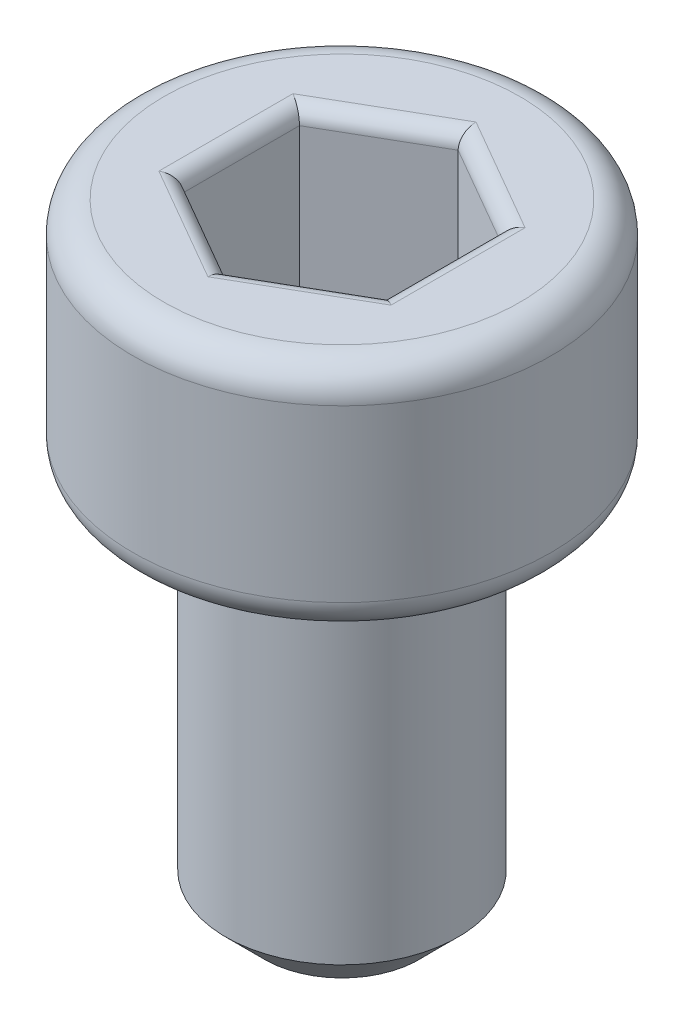
ISO-10303-21;
HEADER;
FILE_DESCRIPTION(('STEP AP214'),'2;1');
FILE_NAME('part.step','',(''),(''),'','','');
FILE_SCHEMA(('AUTOMOTIVE_DESIGN { 1 0 10303 214 1 1 1 1 }'));
ENDSEC;
DATA;
#1=APPLICATION_CONTEXT('core data for automotive mechanical design processes');
#2=APPLICATION_PROTOCOL_DEFINITION('international standard','automotive_design',2000,#1);
#3=PRODUCT_CONTEXT('',#1,'mechanical');
#4=PRODUCT('Part','Part','',(#3));
#5=PRODUCT_RELATED_PRODUCT_CATEGORY('part','',(#4));
#6=PRODUCT_DEFINITION_FORMATION('','',#4);
#7=PRODUCT_DEFINITION_CONTEXT('part definition',#1,'design');
#8=PRODUCT_DEFINITION('design','',#6,#7);
#9=PRODUCT_DEFINITION_SHAPE('','',#8);
#10=(LENGTH_UNIT() NAMED_UNIT(*) SI_UNIT(.MILLI.,.METRE.));
#11=(NAMED_UNIT(*) PLANE_ANGLE_UNIT() SI_UNIT($,.RADIAN.));
#12=(NAMED_UNIT(*) SI_UNIT($,.STERADIAN.) SOLID_ANGLE_UNIT());
#13=UNCERTAINTY_MEASURE_WITH_UNIT(LENGTH_MEASURE(1.E-05),#10,'distance_accuracy_value','');
#14=(GEOMETRIC_REPRESENTATION_CONTEXT(3) GLOBAL_UNCERTAINTY_ASSIGNED_CONTEXT((#13)) GLOBAL_UNIT_ASSIGNED_CONTEXT((#10,
#11,#12)) REPRESENTATION_CONTEXT('',''));
#15=CARTESIAN_POINT('',(0.,0.,0.));
#16=DIRECTION('',(0.,0.,1.));
#17=DIRECTION('',(1.,0.,0.));
#18=AXIS2_PLACEMENT_3D('',#15,#16,#17);
#19=CARTESIAN_POINT('',(-2.69999999999998,0.,0.));
#20=DIRECTION('',(0.,1.,0.));
#21=DIRECTION('',(-1.,0.,0.));
#22=AXIS2_PLACEMENT_3D('',#19,#20,#21);
#23=PLANE('',#22);
#24=DIRECTION('',(0.,0.,1.));
#25=VECTOR('',#24,1.);
#26=CARTESIAN_POINT('',(-1.49903810567666,0.,-0.750000000000001));
#27=LINE('',#26,#25);
#28=CARTESIAN_POINT('',(-1.49903810567666,0.,0.865470053837926));
#29=VERTEX_POINT('',#28);
#30=CARTESIAN_POINT('',(-1.49903810567666,0.,-0.865470053837926));
#31=VERTEX_POINT('',#30);
#32=EDGE_CURVE('E214',#29,#31,#27,.F.);
#33=ORIENTED_EDGE('',*,*,#32,.T.);
#34=DIRECTION('',(-0.866025403784438,0.,0.500000000000001));
#35=VECTOR('',#34,1.);
#36=CARTESIAN_POINT('',(-0.0999999999999996,0.,-1.67320508075689));
#37=LINE('',#36,#35);
#38=CARTESIAN_POINT('',(0.,0.,-1.73094010767585));
#39=VERTEX_POINT('',#38);
#40=EDGE_CURVE('E217',#31,#39,#37,.F.);
#41=ORIENTED_EDGE('',*,*,#40,.T.);
#42=DIRECTION('',(-0.866025403784438,0.,-0.500000000000001));
#43=VECTOR('',#42,1.);
#44=CARTESIAN_POINT('',(1.39903810567666,0.,-0.923205080756888));
#45=LINE('',#44,#43);
#46=CARTESIAN_POINT('',(1.49903810567666,0.,-0.865470053837926));
#47=VERTEX_POINT('',#46);
#48=EDGE_CURVE('E202',#39,#47,#45,.F.);
#49=ORIENTED_EDGE('',*,*,#48,.T.);
#50=DIRECTION('',(0.,0.,-1.));
#51=VECTOR('',#50,1.);
#52=CARTESIAN_POINT('',(1.49903810567666,0.,0.750000000000001));
#53=LINE('',#52,#51);
#54=CARTESIAN_POINT('',(1.49903810567666,0.,0.865470053837926));
#55=VERTEX_POINT('',#54);
#56=EDGE_CURVE('E205',#47,#55,#53,.F.);
#57=ORIENTED_EDGE('',*,*,#56,.T.);
#58=DIRECTION('',(0.866025403784438,0.,-0.500000000000001));
#59=VECTOR('',#58,1.);
#60=CARTESIAN_POINT('',(0.0999999999999994,0.,1.67320508075689));
#61=LINE('',#60,#59);
#62=CARTESIAN_POINT('',(0.,0.,1.73094010767585));
#63=VERTEX_POINT('',#62);
#64=EDGE_CURVE('E208',#55,#63,#61,.F.);
#65=ORIENTED_EDGE('',*,*,#64,.T.);
#66=DIRECTION('',(0.866025403784438,0.,0.500000000000001));
#67=VECTOR('',#66,1.);
#68=CARTESIAN_POINT('',(-1.39903810567666,0.,0.923205080756888));
#69=LINE('',#68,#67);
#70=EDGE_CURVE('E211',#63,#29,#69,.F.);
#71=ORIENTED_EDGE('',*,*,#70,.T.);
#72=EDGE_LOOP('',(#33,#41,#49,#57,#65,#71));
#73=FACE_BOUND('',#72,.T.);
#74=CARTESIAN_POINT('',(0.,0.,0.));
#75=DIRECTION('',(0.,1.,0.));
#76=DIRECTION('',(-1.,0.,0.));
#77=AXIS2_PLACEMENT_3D('',#74,#75,#76);
#78=CIRCLE('',#77,2.29999999999999);
#79=CARTESIAN_POINT('',(-2.29999999999999,0.,0.));
#80=VERTEX_POINT('',#79);
#81=EDGE_CURVE('E195',#80,#80,#78,.T.);
#82=ORIENTED_EDGE('',*,*,#81,.T.);
#83=EDGE_LOOP('',(#82));
#84=FACE_BOUND('',#83,.T.);
#85=ADVANCED_FACE('F39',(#73,#84),#23,.T.);
#86=CARTESIAN_POINT('',(0.,-8.,0.));
#87=DIRECTION('',(0.,-1.,0.));
#88=DIRECTION('',(1.,0.,0.));
#89=AXIS2_PLACEMENT_3D('',#86,#87,#88);
#90=PLANE('',#89);
#91=CARTESIAN_POINT('',(0.,-8.,0.));
#92=DIRECTION('',(0.,1.,0.));
#93=DIRECTION('',(-1.,0.,0.));
#94=AXIS2_PLACEMENT_3D('',#91,#92,#93);
#95=CIRCLE('',#94,1.);
#96=CARTESIAN_POINT('',(-0.999999999999999,-8.,0.));
#97=VERTEX_POINT('',#96);
#98=EDGE_CURVE('E179',#97,#97,#95,.T.);
#99=ORIENTED_EDGE('',*,*,#98,.F.);
#100=EDGE_LOOP('',(#99));
#101=FACE_BOUND('',#100,.T.);
#102=ADVANCED_FACE('F287',(#101),#90,.T.);
#103=CARTESIAN_POINT('',(0.,-7.50000000000001,0.));
#104=DIRECTION('',(0.,1.,0.));
#105=DIRECTION('',(-1.,0.,0.));
#106=AXIS2_PLACEMENT_3D('',#103,#104,#105);
#107=CONICAL_SURFACE('',#106,1.5,0.785398163397455);
#108=ORIENTED_EDGE('',*,*,#98,.T.);
#109=EDGE_LOOP('',(#108));
#110=FACE_BOUND('',#109,.T.);
#111=CARTESIAN_POINT('',(0.,-7.50000000000001,0.));
#112=DIRECTION('',(0.,1.,0.));
#113=DIRECTION('',(-1.,0.,0.));
#114=AXIS2_PLACEMENT_3D('',#111,#112,#113);
#115=CIRCLE('',#114,1.5);
#116=CARTESIAN_POINT('',(-1.5,-7.50000000000001,0.));
#117=VERTEX_POINT('',#116);
#118=EDGE_CURVE('E175',#117,#117,#115,.T.);
#119=ORIENTED_EDGE('',*,*,#118,.F.);
#120=EDGE_LOOP('',(#119));
#121=FACE_BOUND('',#120,.T.);
#122=ADVANCED_FACE('F293',(#110,#121),#107,.T.);
#123=CARTESIAN_POINT('',(0.,0.,0.));
#124=DIRECTION('',(0.,1.,0.));
#125=DIRECTION('',(-1.,0.,0.));
#126=AXIS2_PLACEMENT_3D('',#123,#124,#125);
#127=CYLINDRICAL_SURFACE('',#126,1.5);
#128=ORIENTED_EDGE('',*,*,#118,.T.);
#129=EDGE_LOOP('',(#128));
#130=FACE_BOUND('',#129,.T.);
#131=CARTESIAN_POINT('',(0.,-3.,0.));
#132=DIRECTION('',(0.,1.,0.));
#133=DIRECTION('',(-1.,0.,0.));
#134=AXIS2_PLACEMENT_3D('',#131,#132,#133);
#135=CIRCLE('',#134,1.5);
#136=CARTESIAN_POINT('',(-1.5,-3.,0.));
#137=VERTEX_POINT('',#136);
#138=EDGE_CURVE('E159',#137,#137,#135,.T.);
#139=ORIENTED_EDGE('',*,*,#138,.F.);
#140=EDGE_LOOP('',(#139));
#141=FACE_BOUND('',#140,.T.);
#142=ADVANCED_FACE('F391',(#130,#141),#127,.T.);
#143=CARTESIAN_POINT('',(-1.5,-3.,0.));
#144=DIRECTION('',(0.,-1.,0.));
#145=DIRECTION('',(1.,0.,0.));
#146=AXIS2_PLACEMENT_3D('',#143,#144,#145);
#147=PLANE('',#146);
#148=CARTESIAN_POINT('',(0.,-3.,0.));
#149=DIRECTION('',(0.,-1.,0.));
#150=DIRECTION('',(1.,0.,0.));
#151=AXIS2_PLACEMENT_3D('',#148,#149,#150);
#152=CIRCLE('',#151,2.29999999999999);
#153=CARTESIAN_POINT('',(2.29999999999999,-3.,0.));
#154=VERTEX_POINT('',#153);
#155=EDGE_CURVE('E191',#154,#154,#152,.T.);
#156=ORIENTED_EDGE('',*,*,#155,.T.);
#157=EDGE_LOOP('',(#156));
#158=FACE_BOUND('',#157,.T.);
#159=ORIENTED_EDGE('',*,*,#138,.T.);
#160=EDGE_LOOP('',(#159));
#161=FACE_BOUND('',#160,.T.);
#162=ADVANCED_FACE('F398',(#158,#161),#147,.T.);
#163=CARTESIAN_POINT('',(0.,0.,0.));
#164=DIRECTION('',(0.,1.,0.));
#165=DIRECTION('',(-1.,0.,0.));
#166=AXIS2_PLACEMENT_3D('',#163,#164,#165);
#167=CYLINDRICAL_SURFACE('',#166,2.69999999999999);
#168=CARTESIAN_POINT('',(0.,-2.6,0.));
#169=DIRECTION('',(0.,-1.,0.));
#170=DIRECTION('',(1.,0.,0.));
#171=AXIS2_PLACEMENT_3D('',#168,#169,#170);
#172=CIRCLE('',#171,2.69999999999999);
#173=CARTESIAN_POINT('',(2.69999999999999,-2.6,0.));
#174=VERTEX_POINT('',#173);
#175=EDGE_CURVE('E187',#174,#174,#172,.F.);
#176=ORIENTED_EDGE('',*,*,#175,.T.);
#177=EDGE_LOOP('',(#176));
#178=FACE_BOUND('',#177,.T.);
#179=CARTESIAN_POINT('',(0.,-0.4,0.));
#180=DIRECTION('',(0.,1.,0.));
#181=DIRECTION('',(-1.,0.,0.));
#182=AXIS2_PLACEMENT_3D('',#179,#180,#181);
#183=CIRCLE('',#182,2.69999999999999);
#184=CARTESIAN_POINT('',(-2.69999999999999,-0.4,0.));
#185=VERTEX_POINT('',#184);
#186=EDGE_CURVE('E183',#185,#185,#183,.F.);
#187=ORIENTED_EDGE('',*,*,#186,.T.);
#188=EDGE_LOOP('',(#187));
#189=FACE_BOUND('',#188,.T.);
#190=ADVANCED_FACE('F283',(#178,#189),#167,.T.);
#191=CARTESIAN_POINT('',(0.,-2.,-1.5));
#192=DIRECTION('',(0.500000000000001,0.,-0.866025403784438));
#193=DIRECTION('',(-0.866025403784438,0.,-0.500000000000001));
#194=AXIS2_PLACEMENT_3D('',#191,#192,#193);
#195=PLANE('',#194);
#196=DIRECTION('',(0.,1.,0.));
#197=VECTOR('',#196,1.);
#198=CARTESIAN_POINT('',(1.29903810567666,-2.,-0.750000000000001));
#199=LINE('',#198,#197);
#200=CARTESIAN_POINT('',(1.29903810567666,-2.,-0.750000000000001));
#201=VERTEX_POINT('',#200);
#202=CARTESIAN_POINT('',(1.29903810567666,-0.199999999999999,-0.750000000000001));
#203=VERTEX_POINT('',#202);
#204=EDGE_CURVE('E156',#201,#203,#199,.T.);
#205=ORIENTED_EDGE('',*,*,#204,.T.);
#206=DIRECTION('',(-0.866025403784438,0.,-0.500000000000001));
#207=VECTOR('',#206,1.);
#208=CARTESIAN_POINT('',(0.,-0.2,-1.5));
#209=LINE('',#208,#207);
#210=CARTESIAN_POINT('',(0.,-0.2,-1.5));
#211=VERTEX_POINT('',#210);
#212=EDGE_CURVE('E11',#203,#211,#209,.T.);
#213=ORIENTED_EDGE('',*,*,#212,.T.);
#214=DIRECTION('',(0.,1.,0.));
#215=VECTOR('',#214,1.);
#216=CARTESIAN_POINT('',(0.,-2.,-1.5));
#217=LINE('',#216,#215);
#218=CARTESIAN_POINT('',(0.,-2.,-1.5));
#219=VERTEX_POINT('',#218);
#220=EDGE_CURVE('E112',#219,#211,#217,.T.);
#221=ORIENTED_EDGE('',*,*,#220,.F.);
#222=DIRECTION('',(-0.866025403784438,0.,-0.500000000000001));
#223=VECTOR('',#222,1.);
#224=CARTESIAN_POINT('',(0.,-2.,-1.5));
#225=LINE('',#224,#223);
#226=EDGE_CURVE('E116',#201,#219,#225,.T.);
#227=ORIENTED_EDGE('',*,*,#226,.F.);
#228=EDGE_LOOP('',(#205,#213,#221,#227));
#229=FACE_BOUND('',#228,.T.);
#230=ADVANCED_FACE('F114',(#229),#195,.F.);
#231=CARTESIAN_POINT('',(1.29903810567666,-2.,-0.750000000000001));
#232=DIRECTION('',(1.,0.,0.));
#233=DIRECTION('',(0.,1.,0.));
#234=AXIS2_PLACEMENT_3D('',#231,#232,#233);
#235=PLANE('',#234);
#236=DIRECTION('',(0.,1.,0.));
#237=VECTOR('',#236,1.);
#238=CARTESIAN_POINT('',(1.29903810567666,-2.,0.750000000000001));
#239=LINE('',#238,#237);
#240=CARTESIAN_POINT('',(1.29903810567666,-2.,0.750000000000001));
#241=VERTEX_POINT('',#240);
#242=CARTESIAN_POINT('',(1.29903810567666,-0.2,0.750000000000001));
#243=VERTEX_POINT('',#242);
#244=EDGE_CURVE('E160',#241,#243,#239,.T.);
#245=ORIENTED_EDGE('',*,*,#244,.T.);
#246=DIRECTION('',(0.,0.,-1.));
#247=VECTOR('',#246,1.);
#248=CARTESIAN_POINT('',(1.29903810567666,-0.2,-0.750000000000001));
#249=LINE('',#248,#247);
#250=EDGE_CURVE('E49',#243,#203,#249,.T.);
#251=ORIENTED_EDGE('',*,*,#250,.T.);
#252=ORIENTED_EDGE('',*,*,#204,.F.);
#253=DIRECTION('',(0.,0.,-1.));
#254=VECTOR('',#253,1.);
#255=CARTESIAN_POINT('',(1.29903810567666,-2.,-0.750000000000001));
#256=LINE('',#255,#254);
#257=EDGE_CURVE('E124',#241,#201,#256,.T.);
#258=ORIENTED_EDGE('',*,*,#257,.F.);
#259=EDGE_LOOP('',(#245,#251,#252,#258));
#260=FACE_BOUND('',#259,.T.);
#261=ADVANCED_FACE('F275',(#260),#235,.F.);
#262=CARTESIAN_POINT('',(1.29903810567666,-2.,0.750000000000001));
#263=DIRECTION('',(0.500000000000001,0.,0.866025403784438));
#264=DIRECTION('',(0.866025403784438,0.,-0.500000000000001));
#265=AXIS2_PLACEMENT_3D('',#262,#263,#264);
#266=PLANE('',#265);
#267=DIRECTION('',(0.,1.,0.));
#268=VECTOR('',#267,1.);
#269=CARTESIAN_POINT('',(0.,-2.,1.5));
#270=LINE('',#269,#268);
#271=CARTESIAN_POINT('',(0.,-2.,1.5));
#272=VERTEX_POINT('',#271);
#273=CARTESIAN_POINT('',(0.,-0.2,1.5));
#274=VERTEX_POINT('',#273);
#275=EDGE_CURVE('E163',#272,#274,#270,.T.);
#276=ORIENTED_EDGE('',*,*,#275,.T.);
#277=DIRECTION('',(0.866025403784438,0.,-0.500000000000001));
#278=VECTOR('',#277,1.);
#279=CARTESIAN_POINT('',(1.29903810567666,-0.2,0.750000000000001));
#280=LINE('',#279,#278);
#281=EDGE_CURVE('E64',#274,#243,#280,.T.);
#282=ORIENTED_EDGE('',*,*,#281,.T.);
#283=ORIENTED_EDGE('',*,*,#244,.F.);
#284=DIRECTION('',(0.866025403784438,0.,-0.500000000000001));
#285=VECTOR('',#284,1.);
#286=CARTESIAN_POINT('',(1.29903810567666,-2.,0.750000000000001));
#287=LINE('',#286,#285);
#288=EDGE_CURVE('E151',#272,#241,#287,.T.);
#289=ORIENTED_EDGE('',*,*,#288,.F.);
#290=EDGE_LOOP('',(#276,#282,#283,#289));
#291=FACE_BOUND('',#290,.T.);
#292=ADVANCED_FACE('F274',(#291),#266,.F.);
#293=CARTESIAN_POINT('',(0.,-2.,1.5));
#294=DIRECTION('',(-0.500000000000001,0.,0.866025403784438));
#295=DIRECTION('',(0.866025403784438,0.,0.500000000000001));
#296=AXIS2_PLACEMENT_3D('',#293,#294,#295);
#297=PLANE('',#296);
#298=DIRECTION('',(0.,1.,0.));
#299=VECTOR('',#298,1.);
#300=CARTESIAN_POINT('',(-1.29903810567666,-2.,0.750000000000001));
#301=LINE('',#300,#299);
#302=CARTESIAN_POINT('',(-1.29903810567666,-2.,0.750000000000001));
#303=VERTEX_POINT('',#302);
#304=CARTESIAN_POINT('',(-1.29903810567666,-0.2,0.750000000000001));
#305=VERTEX_POINT('',#304);
#306=EDGE_CURVE('E166',#303,#305,#301,.T.);
#307=ORIENTED_EDGE('',*,*,#306,.T.);
#308=DIRECTION('',(0.866025403784438,0.,0.500000000000001));
#309=VECTOR('',#308,1.);
#310=CARTESIAN_POINT('',(0.,-0.2,1.5));
#311=LINE('',#310,#309);
#312=EDGE_CURVE('E224',#305,#274,#311,.T.);
#313=ORIENTED_EDGE('',*,*,#312,.T.);
#314=ORIENTED_EDGE('',*,*,#275,.F.);
#315=DIRECTION('',(0.866025403784438,0.,0.500000000000001));
#316=VECTOR('',#315,1.);
#317=CARTESIAN_POINT('',(0.,-2.,1.5));
#318=LINE('',#317,#316);
#319=EDGE_CURVE('E147',#303,#272,#318,.T.);
#320=ORIENTED_EDGE('',*,*,#319,.F.);
#321=EDGE_LOOP('',(#307,#313,#314,#320));
#322=FACE_BOUND('',#321,.T.);
#323=ADVANCED_FACE('F273',(#322),#297,.F.);
#324=CARTESIAN_POINT('',(-1.29903810567666,-2.,0.750000000000001));
#325=DIRECTION('',(-1.,0.,0.));
#326=DIRECTION('',(0.,-1.,0.));
#327=AXIS2_PLACEMENT_3D('',#324,#325,#326);
#328=PLANE('',#327);
#329=DIRECTION('',(0.,1.,0.));
#330=VECTOR('',#329,1.);
#331=CARTESIAN_POINT('',(-1.29903810567666,-2.,-0.750000000000001));
#332=LINE('',#331,#330);
#333=CARTESIAN_POINT('',(-1.29903810567666,-2.,-0.750000000000001));
#334=VERTEX_POINT('',#333);
#335=CARTESIAN_POINT('',(-1.29903810567666,-0.2,-0.750000000000001));
#336=VERTEX_POINT('',#335);
#337=EDGE_CURVE('E123',#334,#336,#332,.T.);
#338=ORIENTED_EDGE('',*,*,#337,.T.);
#339=DIRECTION('',(0.,0.,1.));
#340=VECTOR('',#339,1.);
#341=CARTESIAN_POINT('',(-1.29903810567666,-0.2,0.750000000000001));
#342=LINE('',#341,#340);
#343=EDGE_CURVE('E221',#336,#305,#342,.T.);
#344=ORIENTED_EDGE('',*,*,#343,.T.);
#345=ORIENTED_EDGE('',*,*,#306,.F.);
#346=DIRECTION('',(0.,0.,1.));
#347=VECTOR('',#346,1.);
#348=CARTESIAN_POINT('',(-1.29903810567666,-2.,0.750000000000001));
#349=LINE('',#348,#347);
#350=EDGE_CURVE('E134',#334,#303,#349,.T.);
#351=ORIENTED_EDGE('',*,*,#350,.F.);
#352=EDGE_LOOP('',(#338,#344,#345,#351));
#353=FACE_BOUND('',#352,.T.);
#354=ADVANCED_FACE('F269',(#353),#328,.F.);
#355=CARTESIAN_POINT('',(-1.29903810567666,-2.,-0.750000000000001));
#356=DIRECTION('',(-0.500000000000001,0.,-0.866025403784438));
#357=DIRECTION('',(-0.866025403784438,0.,0.500000000000001));
#358=AXIS2_PLACEMENT_3D('',#355,#356,#357);
#359=PLANE('',#358);
#360=ORIENTED_EDGE('',*,*,#220,.T.);
#361=DIRECTION('',(-0.866025403784438,0.,0.500000000000001));
#362=VECTOR('',#361,1.);
#363=CARTESIAN_POINT('',(-1.29903810567666,-0.2,-0.750000000000001));
#364=LINE('',#363,#362);
#365=EDGE_CURVE('E199',#211,#336,#364,.T.);
#366=ORIENTED_EDGE('',*,*,#365,.T.);
#367=ORIENTED_EDGE('',*,*,#337,.F.);
#368=DIRECTION('',(-0.866025403784438,0.,0.500000000000001));
#369=VECTOR('',#368,1.);
#370=CARTESIAN_POINT('',(-1.29903810567666,-2.,-0.750000000000001));
#371=LINE('',#370,#369);
#372=EDGE_CURVE('E127',#219,#334,#371,.T.);
#373=ORIENTED_EDGE('',*,*,#372,.F.);
#374=EDGE_LOOP('',(#360,#366,#367,#373));
#375=FACE_BOUND('',#374,.T.);
#376=ADVANCED_FACE('F128',(#375),#359,.F.);
#377=CARTESIAN_POINT('',(0.,-2.,0.));
#378=DIRECTION('',(0.,-1.,0.));
#379=DIRECTION('',(1.,0.,0.));
#380=AXIS2_PLACEMENT_3D('',#377,#378,#379);
#381=PLANE('',#380);
#382=ORIENTED_EDGE('',*,*,#226,.T.);
#383=ORIENTED_EDGE('',*,*,#372,.T.);
#384=ORIENTED_EDGE('',*,*,#350,.T.);
#385=ORIENTED_EDGE('',*,*,#319,.T.);
#386=ORIENTED_EDGE('',*,*,#288,.T.);
#387=ORIENTED_EDGE('',*,*,#257,.T.);
#388=EDGE_LOOP('',(#382,#383,#384,#385,#386,#387));
#389=FACE_BOUND('',#388,.T.);
#390=ADVANCED_FACE('F136',(#389),#381,.F.);
#391=CARTESIAN_POINT('',(0.,-2.6,0.));
#392=DIRECTION('',(0.,-1.,0.));
#393=DIRECTION('',(1.,0.,0.));
#394=AXIS2_PLACEMENT_3D('',#391,#392,#393);
#395=TOROIDAL_SURFACE('',#394,2.29999999999999,0.4);
#396=ORIENTED_EDGE('',*,*,#155,.F.);
#397=EDGE_LOOP('',(#396));
#398=FACE_BOUND('',#397,.T.);
#399=ORIENTED_EDGE('',*,*,#175,.F.);
#400=EDGE_LOOP('',(#399));
#401=FACE_BOUND('',#400,.T.);
#402=ADVANCED_FACE('F299',(#398,#401),#395,.T.);
#403=CARTESIAN_POINT('',(0.,-0.4,0.));
#404=DIRECTION('',(0.,1.,0.));
#405=DIRECTION('',(-1.,0.,0.));
#406=AXIS2_PLACEMENT_3D('',#403,#404,#405);
#407=TOROIDAL_SURFACE('',#406,2.29999999999999,0.4);
#408=ORIENTED_EDGE('',*,*,#186,.F.);
#409=EDGE_LOOP('',(#408));
#410=FACE_BOUND('',#409,.T.);
#411=ORIENTED_EDGE('',*,*,#81,.F.);
#412=EDGE_LOOP('',(#411));
#413=FACE_BOUND('',#412,.T.);
#414=ADVANCED_FACE('F302',(#410,#413),#407,.T.);
#415=CARTESIAN_POINT('',(1.39903810567666,-0.2,0.923205080756888));
#416=DIRECTION('',(-0.866025403784438,0.,0.500000000000001));
#417=DIRECTION('',(0.500000000000001,0.,0.866025403784438));
#418=AXIS2_PLACEMENT_3D('',#415,#416,#417);
#419=CYLINDRICAL_SURFACE('',#418,0.2);
#420=CARTESIAN_POINT('',(0.,-0.2,1.73094010767585));
#421=DIRECTION('',(-1.,0.,0.));
#422=DIRECTION('',(0.,0.,-1.));
#423=AXIS2_PLACEMENT_3D('',#420,#421,#422);
#424=ELLIPSE('',#423,0.23094010767585,0.2);
#425=EDGE_CURVE('E143',#63,#274,#424,.T.);
#426=ORIENTED_EDGE('',*,*,#425,.F.);
#427=ORIENTED_EDGE('',*,*,#64,.F.);
#428=CARTESIAN_POINT('',(1.49903810567666,-0.2,0.865470053837926));
#429=DIRECTION('',(-0.5,0.,0.866025403784439));
#430=DIRECTION('',(-0.866025403784439,0.,-0.5));
#431=AXIS2_PLACEMENT_3D('',#428,#429,#430);
#432=ELLIPSE('',#431,0.23094010767585,0.2);
#433=EDGE_CURVE('E43',#243,#55,#432,.F.);
#434=ORIENTED_EDGE('',*,*,#433,.F.);
#435=ORIENTED_EDGE('',*,*,#281,.F.);
#436=EDGE_LOOP('',(#426,#427,#434,#435));
#437=FACE_BOUND('',#436,.T.);
#438=ADVANCED_FACE('F41',(#437),#419,.T.);
#439=CARTESIAN_POINT('',(1.49903810567666,-0.2,-0.750000000000001));
#440=DIRECTION('',(0.,0.,1.));
#441=DIRECTION('',(1.,0.,0.));
#442=AXIS2_PLACEMENT_3D('',#439,#440,#441);
#443=CYLINDRICAL_SURFACE('',#442,0.2);
#444=ORIENTED_EDGE('',*,*,#433,.T.);
#445=ORIENTED_EDGE('',*,*,#56,.F.);
#446=CARTESIAN_POINT('',(1.49903810567666,-0.2,-0.865470053837926));
#447=DIRECTION('',(0.5,0.,0.866025403784439));
#448=DIRECTION('',(-0.866025403784439,0.,0.5));
#449=AXIS2_PLACEMENT_3D('',#446,#447,#448);
#450=ELLIPSE('',#449,0.23094010767585,0.2);
#451=EDGE_CURVE('E241',#203,#47,#450,.F.);
#452=ORIENTED_EDGE('',*,*,#451,.F.);
#453=ORIENTED_EDGE('',*,*,#250,.F.);
#454=EDGE_LOOP('',(#444,#445,#452,#453));
#455=FACE_BOUND('',#454,.T.);
#456=ADVANCED_FACE('F258',(#455),#443,.T.);
#457=CARTESIAN_POINT('',(-0.1,-0.2,1.67320508075689));
#458=DIRECTION('',(-0.866025403784438,0.,-0.500000000000001));
#459=DIRECTION('',(-0.500000000000001,0.,0.866025403784438));
#460=AXIS2_PLACEMENT_3D('',#457,#458,#459);
#461=CYLINDRICAL_SURFACE('',#460,0.2);
#462=ORIENTED_EDGE('',*,*,#425,.T.);
#463=ORIENTED_EDGE('',*,*,#312,.F.);
#464=CARTESIAN_POINT('',(-1.49903810567666,-0.2,0.865470053837925));
#465=DIRECTION('',(-0.5,0.,-0.866025403784439));
#466=DIRECTION('',(0.866025403784439,0.,-0.5));
#467=AXIS2_PLACEMENT_3D('',#464,#465,#466);
#468=ELLIPSE('',#467,0.23094010767585,0.2);
#469=EDGE_CURVE('E237',#29,#305,#468,.T.);
#470=ORIENTED_EDGE('',*,*,#469,.F.);
#471=ORIENTED_EDGE('',*,*,#70,.F.);
#472=EDGE_LOOP('',(#462,#463,#470,#471));
#473=FACE_BOUND('',#472,.T.);
#474=ADVANCED_FACE('F250',(#473),#461,.T.);
#475=CARTESIAN_POINT('',(0.1,-0.2,-1.67320508075689));
#476=DIRECTION('',(0.866025403784438,0.,0.500000000000001));
#477=DIRECTION('',(0.500000000000001,0.,-0.866025403784438));
#478=AXIS2_PLACEMENT_3D('',#475,#476,#477);
#479=CYLINDRICAL_SURFACE('',#478,0.2);
#480=ORIENTED_EDGE('',*,*,#451,.T.);
#481=ORIENTED_EDGE('',*,*,#48,.F.);
#482=CARTESIAN_POINT('',(0.,-0.2,-1.73094010767585));
#483=DIRECTION('',(1.,0.,0.));
#484=DIRECTION('',(0.,0.,-1.));
#485=AXIS2_PLACEMENT_3D('',#482,#483,#484);
#486=ELLIPSE('',#485,0.23094010767585,0.2);
#487=EDGE_CURVE('E234',#211,#39,#486,.F.);
#488=ORIENTED_EDGE('',*,*,#487,.F.);
#489=ORIENTED_EDGE('',*,*,#212,.F.);
#490=EDGE_LOOP('',(#480,#481,#488,#489));
#491=FACE_BOUND('',#490,.T.);
#492=ADVANCED_FACE('F261',(#491),#479,.T.);
#493=CARTESIAN_POINT('',(-1.49903810567666,-0.2,0.750000000000001));
#494=DIRECTION('',(0.,0.,-1.));
#495=DIRECTION('',(-1.,0.,0.));
#496=AXIS2_PLACEMENT_3D('',#493,#494,#495);
#497=CYLINDRICAL_SURFACE('',#496,0.2);
#498=ORIENTED_EDGE('',*,*,#469,.T.);
#499=ORIENTED_EDGE('',*,*,#343,.F.);
#500=CARTESIAN_POINT('',(-1.49903810567666,-0.2,-0.865470053837926));
#501=DIRECTION('',(0.5,0.,-0.866025403784439));
#502=DIRECTION('',(0.866025403784439,0.,0.5));
#503=AXIS2_PLACEMENT_3D('',#500,#501,#502);
#504=ELLIPSE('',#503,0.23094010767585,0.2);
#505=EDGE_CURVE('E231',#31,#336,#504,.T.);
#506=ORIENTED_EDGE('',*,*,#505,.F.);
#507=ORIENTED_EDGE('',*,*,#32,.F.);
#508=EDGE_LOOP('',(#498,#499,#506,#507));
#509=FACE_BOUND('',#508,.T.);
#510=ADVANCED_FACE('F309',(#509),#497,.T.);
#511=CARTESIAN_POINT('',(-1.39903810567666,-0.2,-0.923205080756888));
#512=DIRECTION('',(0.866025403784438,0.,-0.500000000000001));
#513=DIRECTION('',(-0.500000000000001,0.,-0.866025403784438));
#514=AXIS2_PLACEMENT_3D('',#511,#512,#513);
#515=CYLINDRICAL_SURFACE('',#514,0.2);
#516=ORIENTED_EDGE('',*,*,#487,.T.);
#517=ORIENTED_EDGE('',*,*,#40,.F.);
#518=ORIENTED_EDGE('',*,*,#505,.T.);
#519=ORIENTED_EDGE('',*,*,#365,.F.);
#520=EDGE_LOOP('',(#516,#517,#518,#519));
#521=FACE_BOUND('',#520,.T.);
#522=ADVANCED_FACE('F265',(#521),#515,.T.);
#523=CLOSED_SHELL('',(#85,#102,#122,#142,#162,#190,#230,#261,#292,#323,#354,#376,#390,#402,#414,
#438,#456,#474,#492,#510,#522));
#524=MANIFOLD_SOLID_BREP('B2',#523);
#525=ADVANCED_BREP_SHAPE_REPRESENTATION('',(#18,#524),#14);
#526=SHAPE_DEFINITION_REPRESENTATION(#9,#525);
ENDSEC;
END-ISO-10303-21;
